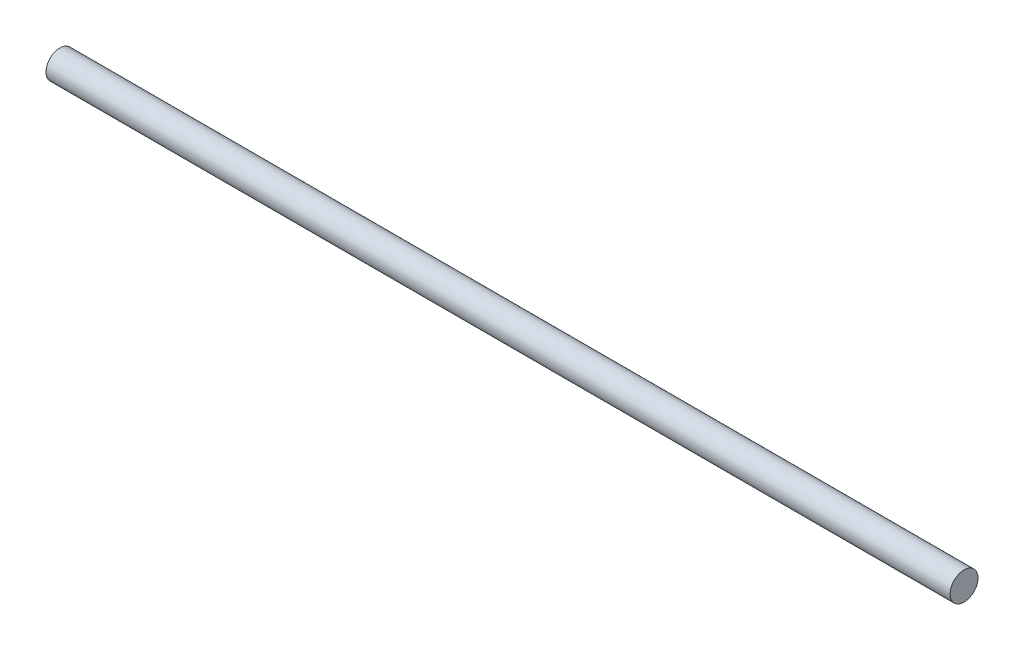
ISO-10303-21;
HEADER;
FILE_DESCRIPTION(('STEP AP214'),'2;1');
FILE_NAME('part.step','',(''),(''),'','','');
FILE_SCHEMA(('AUTOMOTIVE_DESIGN { 1 0 10303 214 1 1 1 1 }'));
ENDSEC;
DATA;
#1=APPLICATION_CONTEXT('core data for automotive mechanical design processes');
#2=APPLICATION_PROTOCOL_DEFINITION('international standard','automotive_design',2000,#1);
#3=PRODUCT_CONTEXT('',#1,'mechanical');
#4=PRODUCT('Part','Part','',(#3));
#5=PRODUCT_RELATED_PRODUCT_CATEGORY('part','',(#4));
#6=PRODUCT_DEFINITION_FORMATION('','',#4);
#7=PRODUCT_DEFINITION_CONTEXT('part definition',#1,'design');
#8=PRODUCT_DEFINITION('design','',#6,#7);
#9=PRODUCT_DEFINITION_SHAPE('','',#8);
#10=(LENGTH_UNIT() NAMED_UNIT(*) SI_UNIT(.MILLI.,.METRE.));
#11=(NAMED_UNIT(*) PLANE_ANGLE_UNIT() SI_UNIT($,.RADIAN.));
#12=(NAMED_UNIT(*) SI_UNIT($,.STERADIAN.) SOLID_ANGLE_UNIT());
#13=UNCERTAINTY_MEASURE_WITH_UNIT(LENGTH_MEASURE(1.E-05),#10,'distance_accuracy_value','');
#14=(GEOMETRIC_REPRESENTATION_CONTEXT(3) GLOBAL_UNCERTAINTY_ASSIGNED_CONTEXT((#13)) GLOBAL_UNIT_ASSIGNED_CONTEXT((#10,
#11,#12)) REPRESENTATION_CONTEXT('',''));
#15=CARTESIAN_POINT('',(0.,0.,0.));
#16=DIRECTION('',(0.,0.,1.));
#17=DIRECTION('',(1.,0.,0.));
#18=AXIS2_PLACEMENT_3D('',#15,#16,#17);
#19=CARTESIAN_POINT('',(405.,0.,0.));
#20=DIRECTION('',(-1.,0.,0.));
#21=DIRECTION('',(0.,0.,1.));
#22=AXIS2_PLACEMENT_3D('',#19,#20,#21);
#23=CYLINDRICAL_SURFACE('',#22,12.5);
#24=CARTESIAN_POINT('',(405.,0.,0.));
#25=DIRECTION('',(1.,0.,0.));
#26=DIRECTION('',(0.,0.,-1.));
#27=AXIS2_PLACEMENT_3D('',#24,#25,#26);
#28=CIRCLE('',#27,12.5);
#29=CARTESIAN_POINT('',(405.,0.,-12.5));
#30=VERTEX_POINT('',#29);
#31=EDGE_CURVE('E10',#30,#30,#28,.T.);
#32=ORIENTED_EDGE('',*,*,#31,.F.);
#33=EDGE_LOOP('',(#32));
#34=FACE_BOUND('',#33,.T.);
#35=CARTESIAN_POINT('',(-405.,0.,0.));
#36=DIRECTION('',(1.,0.,0.));
#37=DIRECTION('',(0.,0.,-1.));
#38=AXIS2_PLACEMENT_3D('',#35,#36,#37);
#39=CIRCLE('',#38,12.5);
#40=CARTESIAN_POINT('',(-405.,0.,-12.5));
#41=VERTEX_POINT('',#40);
#42=EDGE_CURVE('E38',#41,#41,#39,.T.);
#43=ORIENTED_EDGE('',*,*,#42,.T.);
#44=EDGE_LOOP('',(#43));
#45=FACE_BOUND('',#44,.T.);
#46=ADVANCED_FACE('F35',(#34,#45),#23,.T.);
#47=CARTESIAN_POINT('',(405.,0.,0.));
#48=DIRECTION('',(1.,0.,0.));
#49=DIRECTION('',(0.,0.,-1.));
#50=AXIS2_PLACEMENT_3D('',#47,#48,#49);
#51=PLANE('',#50);
#52=ORIENTED_EDGE('',*,*,#31,.T.);
#53=EDGE_LOOP('',(#52));
#54=FACE_BOUND('',#53,.T.);
#55=ADVANCED_FACE('F50',(#54),#51,.T.);
#56=CARTESIAN_POINT('',(-405.,0.,0.));
#57=DIRECTION('',(1.,0.,0.));
#58=DIRECTION('',(0.,0.,-1.));
#59=AXIS2_PLACEMENT_3D('',#56,#57,#58);
#60=PLANE('',#59);
#61=ORIENTED_EDGE('',*,*,#42,.F.);
#62=EDGE_LOOP('',(#61));
#63=FACE_BOUND('',#62,.T.);
#64=ADVANCED_FACE('F48',(#63),#60,.F.);
#65=CLOSED_SHELL('',(#46,#55,#64));
#66=MANIFOLD_SOLID_BREP('B2',#65);
#67=ADVANCED_BREP_SHAPE_REPRESENTATION('',(#18,#66),#14);
#68=SHAPE_DEFINITION_REPRESENTATION(#9,#67);
ENDSEC;
END-ISO-10303-21;
